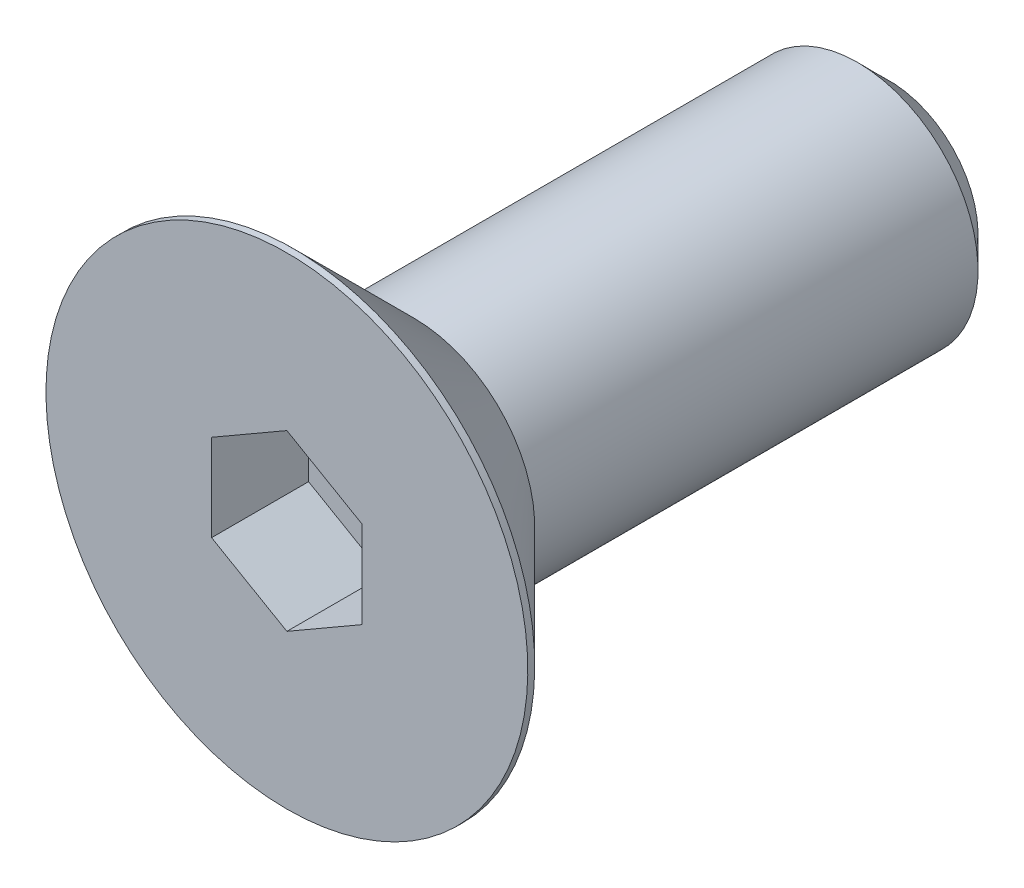
ISO-10303-21;
HEADER;
FILE_DESCRIPTION(('STEP AP214'),'2;1');
FILE_NAME('part.step','',(''),(''),'','','');
FILE_SCHEMA(('AUTOMOTIVE_DESIGN { 1 0 10303 214 1 1 1 1 }'));
ENDSEC;
DATA;
#1=APPLICATION_CONTEXT('core data for automotive mechanical design processes');
#2=APPLICATION_PROTOCOL_DEFINITION('international standard','automotive_design',2000,#1);
#3=PRODUCT_CONTEXT('',#1,'mechanical');
#4=PRODUCT('Part','Part','',(#3));
#5=PRODUCT_RELATED_PRODUCT_CATEGORY('part','',(#4));
#6=PRODUCT_DEFINITION_FORMATION('','',#4);
#7=PRODUCT_DEFINITION_CONTEXT('part definition',#1,'design');
#8=PRODUCT_DEFINITION('design','',#6,#7);
#9=PRODUCT_DEFINITION_SHAPE('','',#8);
#10=(LENGTH_UNIT() NAMED_UNIT(*) SI_UNIT(.MILLI.,.METRE.));
#11=(NAMED_UNIT(*) PLANE_ANGLE_UNIT() SI_UNIT($,.RADIAN.));
#12=(NAMED_UNIT(*) SI_UNIT($,.STERADIAN.) SOLID_ANGLE_UNIT());
#13=UNCERTAINTY_MEASURE_WITH_UNIT(LENGTH_MEASURE(1.E-05),#10,'distance_accuracy_value','');
#14=(GEOMETRIC_REPRESENTATION_CONTEXT(3) GLOBAL_UNCERTAINTY_ASSIGNED_CONTEXT((#13)) GLOBAL_UNIT_ASSIGNED_CONTEXT((#10,
#11,#12)) REPRESENTATION_CONTEXT('',''));
#15=CARTESIAN_POINT('',(0.,0.,0.));
#16=DIRECTION('',(0.,0.,1.));
#17=DIRECTION('',(1.,0.,0.));
#18=AXIS2_PLACEMENT_3D('',#15,#16,#17);
#19=CARTESIAN_POINT('',(0.,-2.,-5.00000000000001));
#20=DIRECTION('',(0.,0.,1.));
#21=DIRECTION('',(0.,-1.,0.));
#22=AXIS2_PLACEMENT_3D('',#19,#20,#21);
#23=PLANE('',#22);
#24=CARTESIAN_POINT('',(0.,0.,-5.00000000000001));
#25=DIRECTION('',(0.,0.,1.));
#26=DIRECTION('',(0.,-1.,0.));
#27=AXIS2_PLACEMENT_3D('',#24,#25,#26);
#28=CIRCLE('',#27,1.475);
#29=CARTESIAN_POINT('',(0.,-1.475,-5.00000000000001));
#30=VERTEX_POINT('',#29);
#31=EDGE_CURVE('E11',#30,#30,#28,.F.);
#32=ORIENTED_EDGE('',*,*,#31,.T.);
#33=EDGE_LOOP('',(#32));
#34=FACE_BOUND('',#33,.T.);
#35=ADVANCED_FACE('F39',(#34),#23,.F.);
#36=CARTESIAN_POINT('',(0.,0.,3.39));
#37=DIRECTION('',(0.,0.,1.));
#38=DIRECTION('',(0.,-1.,0.));
#39=AXIS2_PLACEMENT_3D('',#36,#37,#38);
#40=CYLINDRICAL_SURFACE('',#39,2.00000000000001);
#41=CARTESIAN_POINT('',(0.,0.,2.88500000000001));
#42=DIRECTION('',(0.,0.,1.));
#43=DIRECTION('',(0.,-1.,0.));
#44=AXIS2_PLACEMENT_3D('',#41,#42,#43);
#45=CIRCLE('',#44,2.00000000000001);
#46=CARTESIAN_POINT('',(0.,-2.00000000000001,2.88500000000001));
#47=VERTEX_POINT('',#46);
#48=EDGE_CURVE('E43',#47,#47,#45,.F.);
#49=ORIENTED_EDGE('',*,*,#48,.T.);
#50=EDGE_LOOP('',(#49));
#51=FACE_BOUND('',#50,.T.);
#52=CARTESIAN_POINT('',(0.,0.,-4.47500000000001));
#53=DIRECTION('',(0.,0.,1.));
#54=DIRECTION('',(0.,-1.,0.));
#55=AXIS2_PLACEMENT_3D('',#52,#53,#54);
#56=CIRCLE('',#55,2.00000000000001);
#57=CARTESIAN_POINT('',(0.,-2.00000000000001,-4.47500000000001));
#58=VERTEX_POINT('',#57);
#59=EDGE_CURVE('E48',#58,#58,#56,.T.);
#60=ORIENTED_EDGE('',*,*,#59,.T.);
#61=EDGE_LOOP('',(#60));
#62=FACE_BOUND('',#61,.T.);
#63=ADVANCED_FACE('F159',(#51,#62),#40,.T.);
#64=CARTESIAN_POINT('',(0.,0.,-4.47500000000001));
#65=DIRECTION('',(0.,0.,1.));
#66=DIRECTION('',(0.,-1.,0.));
#67=AXIS2_PLACEMENT_3D('',#64,#65,#66);
#68=CONICAL_SURFACE('',#67,2.00000000000001,0.78539816339745);
#69=ORIENTED_EDGE('',*,*,#31,.F.);
#70=EDGE_LOOP('',(#69));
#71=FACE_BOUND('',#70,.T.);
#72=ORIENTED_EDGE('',*,*,#59,.F.);
#73=EDGE_LOOP('',(#72));
#74=FACE_BOUND('',#73,.T.);
#75=ADVANCED_FACE('F41',(#71,#74),#68,.T.);
#76=CARTESIAN_POINT('',(0.,0.,4.88500000000001));
#77=DIRECTION('',(0.,0.,1.));
#78=DIRECTION('',(0.,-1.,0.));
#79=AXIS2_PLACEMENT_3D('',#76,#77,#78);
#80=CONICAL_SURFACE('',#79,4.,0.785398163397448);
#81=CARTESIAN_POINT('',(0.,0.,4.88500000000001));
#82=DIRECTION('',(0.,0.,1.));
#83=DIRECTION('',(0.,-1.,0.));
#84=AXIS2_PLACEMENT_3D('',#81,#82,#83);
#85=CIRCLE('',#84,4.);
#86=CARTESIAN_POINT('',(0.,-4.,4.88500000000001));
#87=VERTEX_POINT('',#86);
#88=EDGE_CURVE('E142',#87,#87,#85,.T.);
#89=ORIENTED_EDGE('',*,*,#88,.F.);
#90=EDGE_LOOP('',(#89));
#91=FACE_BOUND('',#90,.T.);
#92=ORIENTED_EDGE('',*,*,#48,.F.);
#93=EDGE_LOOP('',(#92));
#94=FACE_BOUND('',#93,.T.);
#95=ADVANCED_FACE('F161',(#91,#94),#80,.T.);
#96=CARTESIAN_POINT('',(0.,0.,5.));
#97=DIRECTION('',(0.,0.,-1.));
#98=DIRECTION('',(0.,1.,0.));
#99=AXIS2_PLACEMENT_3D('',#96,#97,#98);
#100=PLANE('',#99);
#101=DIRECTION('',(0.,1.,0.));
#102=VECTOR('',#101,1.);
#103=CARTESIAN_POINT('',(1.25,-0.721687836487034,5.));
#104=LINE('',#103,#102);
#105=CARTESIAN_POINT('',(1.25,-0.721687836487034,5.));
#106=VERTEX_POINT('',#105);
#107=CARTESIAN_POINT('',(1.25,0.721687836487031,5.));
#108=VERTEX_POINT('',#107);
#109=EDGE_CURVE('E129',#106,#108,#104,.T.);
#110=ORIENTED_EDGE('',*,*,#109,.F.);
#111=DIRECTION('',(0.866025403784438,0.5,0.));
#112=VECTOR('',#111,1.);
#113=CARTESIAN_POINT('',(0.,-1.44337567297407,5.));
#114=LINE('',#113,#112);
#115=CARTESIAN_POINT('',(0.,-1.44337567297407,5.));
#116=VERTEX_POINT('',#115);
#117=EDGE_CURVE('E55',#116,#106,#114,.T.);
#118=ORIENTED_EDGE('',*,*,#117,.F.);
#119=DIRECTION('',(0.866025403784439,-0.5,0.));
#120=VECTOR('',#119,1.);
#121=CARTESIAN_POINT('',(-1.25,-0.721687836487036,5.));
#122=LINE('',#121,#120);
#123=CARTESIAN_POINT('',(-1.25,-0.721687836487036,5.));
#124=VERTEX_POINT('',#123);
#125=EDGE_CURVE('E138',#124,#116,#122,.T.);
#126=ORIENTED_EDGE('',*,*,#125,.F.);
#127=DIRECTION('',(0.,-1.,0.));
#128=VECTOR('',#127,1.);
#129=CARTESIAN_POINT('',(-1.25,0.721687836487031,5.));
#130=LINE('',#129,#128);
#131=CARTESIAN_POINT('',(-1.25,0.721687836487031,5.));
#132=VERTEX_POINT('',#131);
#133=EDGE_CURVE('E136',#132,#124,#130,.T.);
#134=ORIENTED_EDGE('',*,*,#133,.F.);
#135=DIRECTION('',(-0.866025403784439,-0.5,0.));
#136=VECTOR('',#135,1.);
#137=CARTESIAN_POINT('',(0.,1.44337567297406,5.));
#138=LINE('',#137,#136);
#139=CARTESIAN_POINT('',(0.,1.44337567297406,5.));
#140=VERTEX_POINT('',#139);
#141=EDGE_CURVE('E103',#140,#132,#138,.T.);
#142=ORIENTED_EDGE('',*,*,#141,.F.);
#143=DIRECTION('',(-0.866025403784439,0.5,0.));
#144=VECTOR('',#143,1.);
#145=CARTESIAN_POINT('',(1.25,0.721687836487031,5.));
#146=LINE('',#145,#144);
#147=EDGE_CURVE('E132',#108,#140,#146,.T.);
#148=ORIENTED_EDGE('',*,*,#147,.F.);
#149=EDGE_LOOP('',(#110,#118,#126,#134,#142,#148));
#150=FACE_BOUND('',#149,.T.);
#151=CARTESIAN_POINT('',(0.,0.,5.));
#152=DIRECTION('',(0.,0.,1.));
#153=DIRECTION('',(0.,-1.,0.));
#154=AXIS2_PLACEMENT_3D('',#151,#152,#153);
#155=CIRCLE('',#154,4.);
#156=CARTESIAN_POINT('',(0.,-4.,5.));
#157=VERTEX_POINT('',#156);
#158=EDGE_CURVE('E150',#157,#157,#155,.T.);
#159=ORIENTED_EDGE('',*,*,#158,.T.);
#160=EDGE_LOOP('',(#159));
#161=FACE_BOUND('',#160,.T.);
#162=ADVANCED_FACE('F163',(#150,#161),#100,.F.);
#163=CARTESIAN_POINT('',(0.,0.,5.));
#164=DIRECTION('',(0.,0.,1.));
#165=DIRECTION('',(0.,-1.,0.));
#166=AXIS2_PLACEMENT_3D('',#163,#164,#165);
#167=CYLINDRICAL_SURFACE('',#166,4.);
#168=ORIENTED_EDGE('',*,*,#88,.T.);
#169=EDGE_LOOP('',(#168));
#170=FACE_BOUND('',#169,.T.);
#171=ORIENTED_EDGE('',*,*,#158,.F.);
#172=EDGE_LOOP('',(#171));
#173=FACE_BOUND('',#172,.T.);
#174=ADVANCED_FACE('F170',(#170,#173),#167,.T.);
#175=CARTESIAN_POINT('',(0.,-1.44337567297407,3.39));
#176=DIRECTION('',(0.5,-0.866025403784438,0.));
#177=DIRECTION('',(0.866025403784438,0.5,0.));
#178=AXIS2_PLACEMENT_3D('',#175,#176,#177);
#179=PLANE('',#178);
#180=ORIENTED_EDGE('',*,*,#117,.T.);
#181=DIRECTION('',(0.,0.,1.));
#182=VECTOR('',#181,1.);
#183=CARTESIAN_POINT('',(1.25,-0.721687836487034,3.39));
#184=LINE('',#183,#182);
#185=CARTESIAN_POINT('',(1.25,-0.721687836487034,3.39));
#186=VERTEX_POINT('',#185);
#187=EDGE_CURVE('E85',#186,#106,#184,.T.);
#188=ORIENTED_EDGE('',*,*,#187,.F.);
#189=DIRECTION('',(0.866025403784438,0.5,0.));
#190=VECTOR('',#189,1.);
#191=CARTESIAN_POINT('',(0.,-1.44337567297407,3.39));
#192=LINE('',#191,#190);
#193=CARTESIAN_POINT('',(0.,-1.44337567297407,3.39));
#194=VERTEX_POINT('',#193);
#195=EDGE_CURVE('E140',#194,#186,#192,.T.);
#196=ORIENTED_EDGE('',*,*,#195,.F.);
#197=DIRECTION('',(0.,0.,1.));
#198=VECTOR('',#197,1.);
#199=CARTESIAN_POINT('',(0.,-1.44337567297407,3.39));
#200=LINE('',#199,#198);
#201=EDGE_CURVE('E63',#194,#116,#200,.T.);
#202=ORIENTED_EDGE('',*,*,#201,.T.);
#203=EDGE_LOOP('',(#180,#188,#196,#202));
#204=FACE_BOUND('',#203,.T.);
#205=ADVANCED_FACE('F223',(#204),#179,.F.);
#206=CARTESIAN_POINT('',(-1.25,-0.721687836487036,3.39));
#207=DIRECTION('',(-0.5,-0.866025403784439,0.));
#208=DIRECTION('',(0.866025403784439,-0.5,0.));
#209=AXIS2_PLACEMENT_3D('',#206,#207,#208);
#210=PLANE('',#209);
#211=ORIENTED_EDGE('',*,*,#125,.T.);
#212=ORIENTED_EDGE('',*,*,#201,.F.);
#213=DIRECTION('',(0.866025403784439,-0.5,0.));
#214=VECTOR('',#213,1.);
#215=CARTESIAN_POINT('',(-1.25,-0.721687836487036,3.39));
#216=LINE('',#215,#214);
#217=CARTESIAN_POINT('',(-1.25,-0.721687836487036,3.39));
#218=VERTEX_POINT('',#217);
#219=EDGE_CURVE('E115',#218,#194,#216,.T.);
#220=ORIENTED_EDGE('',*,*,#219,.F.);
#221=DIRECTION('',(0.,0.,1.));
#222=VECTOR('',#221,1.);
#223=CARTESIAN_POINT('',(-1.25,-0.721687836487036,3.39));
#224=LINE('',#223,#222);
#225=EDGE_CURVE('E107',#218,#124,#224,.T.);
#226=ORIENTED_EDGE('',*,*,#225,.T.);
#227=EDGE_LOOP('',(#211,#212,#220,#226));
#228=FACE_BOUND('',#227,.T.);
#229=ADVANCED_FACE('F233',(#228),#210,.F.);
#230=CARTESIAN_POINT('',(-1.25,0.721687836487031,3.39));
#231=DIRECTION('',(-1.,0.,0.));
#232=DIRECTION('',(0.,-1.,0.));
#233=AXIS2_PLACEMENT_3D('',#230,#231,#232);
#234=PLANE('',#233);
#235=ORIENTED_EDGE('',*,*,#133,.T.);
#236=ORIENTED_EDGE('',*,*,#225,.F.);
#237=DIRECTION('',(0.,-1.,0.));
#238=VECTOR('',#237,1.);
#239=CARTESIAN_POINT('',(-1.25,0.721687836487031,3.39));
#240=LINE('',#239,#238);
#241=CARTESIAN_POINT('',(-1.25,0.721687836487031,3.39));
#242=VERTEX_POINT('',#241);
#243=EDGE_CURVE('E111',#242,#218,#240,.T.);
#244=ORIENTED_EDGE('',*,*,#243,.F.);
#245=DIRECTION('',(0.,0.,1.));
#246=VECTOR('',#245,1.);
#247=CARTESIAN_POINT('',(-1.25,0.721687836487031,3.39));
#248=LINE('',#247,#246);
#249=EDGE_CURVE('E96',#242,#132,#248,.T.);
#250=ORIENTED_EDGE('',*,*,#249,.T.);
#251=EDGE_LOOP('',(#235,#236,#244,#250));
#252=FACE_BOUND('',#251,.T.);
#253=ADVANCED_FACE('F112',(#252),#234,.F.);
#254=CARTESIAN_POINT('',(0.,1.44337567297406,3.39));
#255=DIRECTION('',(-0.5,0.866025403784438,0.));
#256=DIRECTION('',(-0.866025403784439,-0.5,0.));
#257=AXIS2_PLACEMENT_3D('',#254,#255,#256);
#258=PLANE('',#257);
#259=ORIENTED_EDGE('',*,*,#141,.T.);
#260=ORIENTED_EDGE('',*,*,#249,.F.);
#261=DIRECTION('',(-0.866025403784439,-0.5,0.));
#262=VECTOR('',#261,1.);
#263=CARTESIAN_POINT('',(0.,1.44337567297406,3.39));
#264=LINE('',#263,#262);
#265=CARTESIAN_POINT('',(0.,1.44337567297406,3.39));
#266=VERTEX_POINT('',#265);
#267=EDGE_CURVE('E100',#266,#242,#264,.T.);
#268=ORIENTED_EDGE('',*,*,#267,.F.);
#269=DIRECTION('',(0.,0.,1.));
#270=VECTOR('',#269,1.);
#271=CARTESIAN_POINT('',(0.,1.44337567297406,3.39));
#272=LINE('',#271,#270);
#273=EDGE_CURVE('E108',#266,#140,#272,.T.);
#274=ORIENTED_EDGE('',*,*,#273,.T.);
#275=EDGE_LOOP('',(#259,#260,#268,#274));
#276=FACE_BOUND('',#275,.T.);
#277=ADVANCED_FACE('F98',(#276),#258,.F.);
#278=CARTESIAN_POINT('',(1.25,0.721687836487031,3.39));
#279=DIRECTION('',(0.5,0.866025403784439,0.));
#280=DIRECTION('',(-0.866025403784439,0.5,0.));
#281=AXIS2_PLACEMENT_3D('',#278,#279,#280);
#282=PLANE('',#281);
#283=ORIENTED_EDGE('',*,*,#147,.T.);
#284=ORIENTED_EDGE('',*,*,#273,.F.);
#285=DIRECTION('',(-0.866025403784439,0.5,0.));
#286=VECTOR('',#285,1.);
#287=CARTESIAN_POINT('',(1.25,0.721687836487031,3.39));
#288=LINE('',#287,#286);
#289=CARTESIAN_POINT('',(1.25,0.721687836487031,3.39));
#290=VERTEX_POINT('',#289);
#291=EDGE_CURVE('E121',#290,#266,#288,.T.);
#292=ORIENTED_EDGE('',*,*,#291,.F.);
#293=DIRECTION('',(0.,0.,1.));
#294=VECTOR('',#293,1.);
#295=CARTESIAN_POINT('',(1.25,0.721687836487031,3.39));
#296=LINE('',#295,#294);
#297=EDGE_CURVE('E145',#290,#108,#296,.T.);
#298=ORIENTED_EDGE('',*,*,#297,.T.);
#299=EDGE_LOOP('',(#283,#284,#292,#298));
#300=FACE_BOUND('',#299,.T.);
#301=ADVANCED_FACE('F261',(#300),#282,.F.);
#302=CARTESIAN_POINT('',(1.25,-0.721687836487034,3.39));
#303=DIRECTION('',(1.,0.,0.));
#304=DIRECTION('',(0.,1.,0.));
#305=AXIS2_PLACEMENT_3D('',#302,#303,#304);
#306=PLANE('',#305);
#307=ORIENTED_EDGE('',*,*,#109,.T.);
#308=ORIENTED_EDGE('',*,*,#297,.F.);
#309=DIRECTION('',(0.,1.,0.));
#310=VECTOR('',#309,1.);
#311=CARTESIAN_POINT('',(1.25,-0.721687836487034,3.39));
#312=LINE('',#311,#310);
#313=EDGE_CURVE('E123',#186,#290,#312,.T.);
#314=ORIENTED_EDGE('',*,*,#313,.F.);
#315=ORIENTED_EDGE('',*,*,#187,.T.);
#316=EDGE_LOOP('',(#307,#308,#314,#315));
#317=FACE_BOUND('',#316,.T.);
#318=ADVANCED_FACE('F271',(#317),#306,.F.);
#319=CARTESIAN_POINT('',(1.25,-0.721687836487034,3.39));
#320=DIRECTION('',(0.,0.,1.));
#321=DIRECTION('',(1.,0.,0.));
#322=AXIS2_PLACEMENT_3D('',#319,#320,#321);
#323=PLANE('',#322);
#324=ORIENTED_EDGE('',*,*,#195,.T.);
#325=ORIENTED_EDGE('',*,*,#313,.T.);
#326=ORIENTED_EDGE('',*,*,#291,.T.);
#327=ORIENTED_EDGE('',*,*,#267,.T.);
#328=ORIENTED_EDGE('',*,*,#243,.T.);
#329=ORIENTED_EDGE('',*,*,#219,.T.);
#330=EDGE_LOOP('',(#324,#325,#326,#327,#328,#329));
#331=FACE_BOUND('',#330,.T.);
#332=ADVANCED_FACE('F118',(#331),#323,.T.);
#333=CLOSED_SHELL('',(#35,#63,#75,#95,#162,#174,#205,#229,#253,#277,#301,#318,#332));
#334=MANIFOLD_SOLID_BREP('B2',#333);
#335=ADVANCED_BREP_SHAPE_REPRESENTATION('',(#18,#334),#14);
#336=SHAPE_DEFINITION_REPRESENTATION(#9,#335);
ENDSEC;
END-ISO-10303-21;
